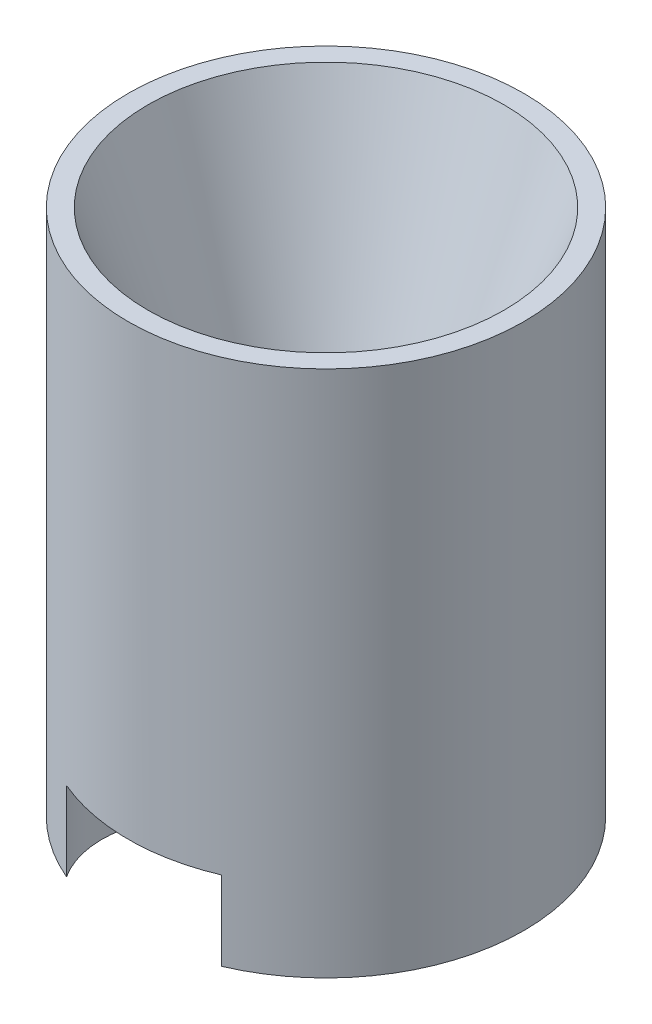
ISO-10303-21;
HEADER;
FILE_DESCRIPTION(('STEP AP214'),'2;1');
FILE_NAME('part.step','',(''),(''),'','','');
FILE_SCHEMA(('AUTOMOTIVE_DESIGN { 1 0 10303 214 1 1 1 1 }'));
ENDSEC;
DATA;
#1=APPLICATION_CONTEXT('core data for automotive mechanical design processes');
#2=APPLICATION_PROTOCOL_DEFINITION('international standard','automotive_design',2000,#1);
#3=PRODUCT_CONTEXT('',#1,'mechanical');
#4=PRODUCT('Part','Part','',(#3));
#5=PRODUCT_RELATED_PRODUCT_CATEGORY('part','',(#4));
#6=PRODUCT_DEFINITION_FORMATION('','',#4);
#7=PRODUCT_DEFINITION_CONTEXT('part definition',#1,'design');
#8=PRODUCT_DEFINITION('design','',#6,#7);
#9=PRODUCT_DEFINITION_SHAPE('','',#8);
#10=(LENGTH_UNIT() NAMED_UNIT(*) SI_UNIT(.MILLI.,.METRE.));
#11=(NAMED_UNIT(*) PLANE_ANGLE_UNIT() SI_UNIT($,.RADIAN.));
#12=(NAMED_UNIT(*) SI_UNIT($,.STERADIAN.) SOLID_ANGLE_UNIT());
#13=UNCERTAINTY_MEASURE_WITH_UNIT(LENGTH_MEASURE(1.E-05),#10,'distance_accuracy_value','');
#14=(GEOMETRIC_REPRESENTATION_CONTEXT(3) GLOBAL_UNCERTAINTY_ASSIGNED_CONTEXT((#13)) GLOBAL_UNIT_ASSIGNED_CONTEXT((#10,
#11,#12)) REPRESENTATION_CONTEXT('',''));
#15=CARTESIAN_POINT('',(0.,0.,0.));
#16=DIRECTION('',(0.,0.,1.));
#17=DIRECTION('',(1.,0.,0.));
#18=AXIS2_PLACEMENT_3D('',#15,#16,#17);
#19=CARTESIAN_POINT('',(0.,20.,0.));
#20=DIRECTION('',(0.,1.,0.));
#21=DIRECTION('',(0.,0.,1.));
#22=AXIS2_PLACEMENT_3D('',#19,#20,#21);
#23=PLANE('',#22);
#24=CARTESIAN_POINT('',(0.,20.,0.));
#25=DIRECTION('',(0.,1.,0.));
#26=DIRECTION('',(0.,0.,1.));
#27=AXIS2_PLACEMENT_3D('',#24,#25,#26);
#28=CIRCLE('',#27,6.75);
#29=CARTESIAN_POINT('',(0.,20.,6.75));
#30=VERTEX_POINT('',#29);
#31=EDGE_CURVE('E105',#30,#30,#28,.F.);
#32=ORIENTED_EDGE('',*,*,#31,.T.);
#33=EDGE_LOOP('',(#32));
#34=FACE_BOUND('',#33,.T.);
#35=CARTESIAN_POINT('',(0.,20.,0.));
#36=DIRECTION('',(0.,1.,0.));
#37=DIRECTION('',(0.,0.,1.));
#38=AXIS2_PLACEMENT_3D('',#35,#36,#37);
#39=CIRCLE('',#38,7.5);
#40=CARTESIAN_POINT('',(0.,20.,7.5));
#41=VERTEX_POINT('',#40);
#42=EDGE_CURVE('E91',#41,#41,#39,.T.);
#43=ORIENTED_EDGE('',*,*,#42,.T.);
#44=EDGE_LOOP('',(#43));
#45=FACE_BOUND('',#44,.T.);
#46=ADVANCED_FACE('F47',(#34,#45),#23,.T.);
#47=CARTESIAN_POINT('',(0.,0.,0.));
#48=DIRECTION('',(0.,1.,0.));
#49=DIRECTION('',(0.,0.,1.));
#50=AXIS2_PLACEMENT_3D('',#47,#48,#49);
#51=PLANE('',#50);
#52=CARTESIAN_POINT('',(0.,0.,0.));
#53=DIRECTION('',(0.,1.,0.));
#54=DIRECTION('',(0.,0.,1.));
#55=AXIS2_PLACEMENT_3D('',#52,#53,#54);
#56=CIRCLE('',#55,7.5);
#57=CARTESIAN_POINT('',(2.93938769133981,0.,6.9));
#58=VERTEX_POINT('',#57);
#59=CARTESIAN_POINT('',(-2.93938769133981,0.,6.9));
#60=VERTEX_POINT('',#59);
#61=EDGE_CURVE('E86',#58,#60,#56,.T.);
#62=ORIENTED_EDGE('',*,*,#61,.F.);
#63=CARTESIAN_POINT('',(0.,0.,5.));
#64=DIRECTION('',(0.,-1.,0.));
#65=DIRECTION('',(0.,0.,-1.));
#66=AXIS2_PLACEMENT_3D('',#63,#64,#65);
#67=CIRCLE('',#66,3.5);
#68=EDGE_CURVE('E75',#60,#58,#67,.T.);
#69=ORIENTED_EDGE('',*,*,#68,.F.);
#70=EDGE_LOOP('',(#62,#69));
#71=FACE_BOUND('',#70,.T.);
#72=CARTESIAN_POINT('',(0.,0.,0.));
#73=DIRECTION('',(0.,1.,0.));
#74=DIRECTION('',(0.,0.,1.));
#75=AXIS2_PLACEMENT_3D('',#72,#73,#74);
#76=CIRCLE('',#75,0.75);
#77=CARTESIAN_POINT('',(0.,0.,0.75));
#78=VERTEX_POINT('',#77);
#79=EDGE_CURVE('E92',#78,#78,#76,.T.);
#80=ORIENTED_EDGE('',*,*,#79,.T.);
#81=EDGE_LOOP('',(#80));
#82=FACE_BOUND('',#81,.T.);
#83=ADVANCED_FACE('F88',(#71,#82),#51,.F.);
#84=CARTESIAN_POINT('',(0.,20.,0.));
#85=DIRECTION('',(0.,-1.,0.));
#86=DIRECTION('',(0.,0.,-1.));
#87=AXIS2_PLACEMENT_3D('',#84,#85,#86);
#88=CYLINDRICAL_SURFACE('',#87,7.5);
#89=ORIENTED_EDGE('',*,*,#61,.T.);
#90=DIRECTION('',(0.,-1.,0.));
#91=VECTOR('',#90,1.);
#92=CARTESIAN_POINT('',(-2.93938769133981,1.5,6.9));
#93=LINE('',#92,#91);
#94=CARTESIAN_POINT('',(-2.93938769133981,3.,6.9));
#95=VERTEX_POINT('',#94);
#96=EDGE_CURVE('E11',#60,#95,#93,.F.);
#97=ORIENTED_EDGE('',*,*,#96,.T.);
#98=CARTESIAN_POINT('',(0.,3.,0.));
#99=DIRECTION('',(0.,-1.,0.));
#100=DIRECTION('',(0.,0.,-1.));
#101=AXIS2_PLACEMENT_3D('',#98,#99,#100);
#102=CIRCLE('',#101,7.5);
#103=CARTESIAN_POINT('',(2.93938769133981,3.,6.9));
#104=VERTEX_POINT('',#103);
#105=EDGE_CURVE('E67',#104,#95,#102,.T.);
#106=ORIENTED_EDGE('',*,*,#105,.F.);
#107=DIRECTION('',(0.,-1.,0.));
#108=VECTOR('',#107,1.);
#109=CARTESIAN_POINT('',(2.93938769133981,1.5,6.9));
#110=LINE('',#109,#108);
#111=EDGE_CURVE('E57',#104,#58,#110,.T.);
#112=ORIENTED_EDGE('',*,*,#111,.T.);
#113=EDGE_LOOP('',(#89,#97,#106,#112));
#114=FACE_BOUND('',#113,.T.);
#115=ORIENTED_EDGE('',*,*,#42,.F.);
#116=EDGE_LOOP('',(#115));
#117=FACE_BOUND('',#116,.T.);
#118=ADVANCED_FACE('F84',(#114,#117),#88,.T.);
#119=CARTESIAN_POINT('',(0.,20.,0.));
#120=DIRECTION('',(0.,-1.,0.));
#121=DIRECTION('',(0.,0.,-1.));
#122=AXIS2_PLACEMENT_3D('',#119,#120,#121);
#123=CYLINDRICAL_SURFACE('',#122,0.75);
#124=CARTESIAN_POINT('',(0.,3.51513548327231,0.));
#125=DIRECTION('',(0.,1.,0.));
#126=DIRECTION('',(0.,0.,1.));
#127=AXIS2_PLACEMENT_3D('',#124,#125,#126);
#128=CIRCLE('',#127,0.75);
#129=CARTESIAN_POINT('',(0.,3.51513548327231,0.75));
#130=VERTEX_POINT('',#129);
#131=EDGE_CURVE('E97',#130,#130,#128,.T.);
#132=ORIENTED_EDGE('',*,*,#131,.T.);
#133=EDGE_LOOP('',(#132));
#134=FACE_BOUND('',#133,.T.);
#135=ORIENTED_EDGE('',*,*,#79,.F.);
#136=EDGE_LOOP('',(#135));
#137=FACE_BOUND('',#136,.T.);
#138=ADVANCED_FACE('F116',(#134,#137),#123,.F.);
#139=CARTESIAN_POINT('',(0.,3.51513548327231,0.));
#140=DIRECTION('',(0.,1.,0.));
#141=DIRECTION('',(0.,0.,1.));
#142=AXIS2_PLACEMENT_3D('',#139,#140,#141);
#143=CONICAL_SURFACE('',#142,0.75,0.349065850398867);
#144=CARTESIAN_POINT('',(0.,20.,6.75));
#145=CARTESIAN_POINT('',(0.,19.8282826612841,6.6875));
#146=CARTESIAN_POINT('',(0.,19.6565653225682,6.625));
#147=CARTESIAN_POINT('',(0.,19.3131306451363,6.5));
#148=CARTESIAN_POINT('',(0.,19.1414133064204,6.4375));
#149=CARTESIAN_POINT('',(0.,18.7979786289886,6.3125));
#150=CARTESIAN_POINT('',(0.,18.6262612902727,6.25));
#151=CARTESIAN_POINT('',(0.,18.2828266128409,6.125));
#152=CARTESIAN_POINT('',(0.,18.1111092741249,6.0625));
#153=CARTESIAN_POINT('',(0.,17.7676745966931,5.9375));
#154=CARTESIAN_POINT('',(0.,17.5959572579772,5.875));
#155=CARTESIAN_POINT('',(0.,17.2525225805454,5.75));
#156=CARTESIAN_POINT('',(0.,17.0808052418295,5.6875));
#157=CARTESIAN_POINT('',(0.,16.7373705643976,5.5625));
#158=CARTESIAN_POINT('',(0.,16.5656532256817,5.5));
#159=CARTESIAN_POINT('',(0.,16.2222185482499,5.375));
#160=CARTESIAN_POINT('',(0.,16.050501209534,5.3125));
#161=CARTESIAN_POINT('',(0.,15.7070665321022,5.1875));
#162=CARTESIAN_POINT('',(0.,15.5353491933862,5.125));
#163=CARTESIAN_POINT('',(0.,15.1919145159544,5.));
#164=CARTESIAN_POINT('',(0.,15.0201971772385,4.9375));
#165=CARTESIAN_POINT('',(0.,14.6767624998067,4.8125));
#166=CARTESIAN_POINT('',(0.,14.5050451610908,4.75));
#167=CARTESIAN_POINT('',(0.,14.1616104836589,4.625));
#168=CARTESIAN_POINT('',(0.,13.989893144943,4.5625));
#169=CARTESIAN_POINT('',(0.,13.6464584675112,4.4375));
#170=CARTESIAN_POINT('',(0.,13.4747411287953,4.375));
#171=CARTESIAN_POINT('',(0.,13.1313064513635,4.25));
#172=CARTESIAN_POINT('',(0.,12.9595891126475,4.1875));
#173=CARTESIAN_POINT('',(0.,12.6161544352157,4.0625));
#174=CARTESIAN_POINT('',(0.,12.4444370964998,4.));
#175=CARTESIAN_POINT('',(0.,12.101002419068,3.875));
#176=CARTESIAN_POINT('',(0.,11.9292850803521,3.8125));
#177=CARTESIAN_POINT('',(0.,11.5858504029202,3.6875));
#178=CARTESIAN_POINT('',(0.,11.4141330642043,3.625));
#179=CARTESIAN_POINT('',(0.,11.0706983867725,3.5));
#180=CARTESIAN_POINT('',(0.,10.8989810480566,3.4375));
#181=CARTESIAN_POINT('',(0.,10.5555463706248,3.3125));
#182=CARTESIAN_POINT('',(0.,10.3838290319088,3.25));
#183=CARTESIAN_POINT('',(0.,10.040394354477,3.125));
#184=CARTESIAN_POINT('',(0.,9.8686770157611,3.0625));
#185=CARTESIAN_POINT('',(0.,9.52524233832928,2.9375));
#186=CARTESIAN_POINT('',(0.,9.35352499961336,2.875));
#187=CARTESIAN_POINT('',(0.,9.01009032218154,2.75));
#188=CARTESIAN_POINT('',(0.,8.83837298346562,2.6875));
#189=CARTESIAN_POINT('',(0.,8.4949383060338,2.5625));
#190=CARTESIAN_POINT('',(0.,8.32322096731788,2.5));
#191=CARTESIAN_POINT('',(0.,7.97978628988606,2.375));
#192=CARTESIAN_POINT('',(0.,7.80806895117014,2.3125));
#193=CARTESIAN_POINT('',(0.,7.46463427373832,2.1875));
#194=CARTESIAN_POINT('',(0.,7.2929169350224,2.125));
#195=CARTESIAN_POINT('',(0.,6.94948225759057,2.));
#196=CARTESIAN_POINT('',(0.,6.77776491887466,1.9375));
#197=CARTESIAN_POINT('',(0.,6.43433024144283,1.8125));
#198=CARTESIAN_POINT('',(0.,6.26261290272692,1.75));
#199=CARTESIAN_POINT('',(0.,5.9191782252951,1.625));
#200=CARTESIAN_POINT('',(0.,5.74746088657918,1.5625));
#201=CARTESIAN_POINT('',(0.,5.40402620914735,1.4375));
#202=CARTESIAN_POINT('',(0.,5.23230887043144,1.375));
#203=CARTESIAN_POINT('',(0.,4.88887419299961,1.25));
#204=CARTESIAN_POINT('',(0.,4.7171568542837,1.1875));
#205=CARTESIAN_POINT('',(0.,4.37372217685187,1.0625));
#206=CARTESIAN_POINT('',(0.,4.20200483813596,1.));
#207=CARTESIAN_POINT('',(0.,3.85857016070413,0.875));
#208=CARTESIAN_POINT('',(0.,3.68685282198822,0.8125));
#209=CARTESIAN_POINT('',(0.,3.51513548327231,0.75));
#210=B_SPLINE_CURVE_WITH_KNOTS('',3,(#144,#145,#146,#147,#148,#149,#150,#151,#152,#153,#154,
#155,#156,#157,#158,#159,#160,#161,#162,#163,#164,#165,#166,#167,#168,#169,#170,#171,#172,#173,
#174,#175,#176,#177,#178,#179,#180,#181,#182,#183,#184,#185,#186,#187,#188,#189,#190,#191,#192,
#193,#194,#195,#196,#197,#198,#199,#200,#201,#202,#203,#204,#205,#206,#207,#208,#209),
.UNSPECIFIED.,.F.,.F.,(4,2,2,2,2,2,2,2,2,2,2,2,2,2,2,2,2,2,2,2,2,2,2,2,2,2,2,2,2,2,2,2,4),(0.,
0.548213325030578,1.09642665006116,1.64463997509173,2.19285330012231,2.74106662515289,
3.28927995018346,3.83749327521404,4.38570660024462,4.9339199252752,5.48213325030578,
6.03034657533635,6.57855990036693,7.12677322539751,7.67498655042809,8.22319987545866,
8.77141320048924,9.31962652551982,9.8678398505504,10.416053175581,10.9642665006116,
11.5124798256421,12.0606931506727,12.6089064757033,13.1571198007339,13.7053331257644,
14.253546450795,14.8017597758256,15.3499731008562,15.8981864258867,16.4463997509173,
16.9946130759479,17.5428264009785),.UNSPECIFIED.);
#211=EDGE_CURVE('BSEAM50',#30,#130,#210,.T.);
#212=ORIENTED_EDGE('',*,*,#31,.F.);
#213=ORIENTED_EDGE('',*,*,#131,.F.);
#214=ORIENTED_EDGE('',*,*,#211,.T.);
#215=ORIENTED_EDGE('',*,*,#211,.F.);
#216=EDGE_LOOP('',(#212,#214,#213,#215));
#217=FACE_BOUND('',#216,.T.);
#218=ADVANCED_FACE('F50',(#217),#143,.F.);
#219=CARTESIAN_POINT('',(0.,3.,5.));
#220=DIRECTION('',(0.,-1.,0.));
#221=DIRECTION('',(0.,0.,-1.));
#222=AXIS2_PLACEMENT_3D('',#219,#220,#221);
#223=CYLINDRICAL_SURFACE('',#222,3.5);
#224=ORIENTED_EDGE('',*,*,#68,.T.);
#225=ORIENTED_EDGE('',*,*,#111,.F.);
#226=CARTESIAN_POINT('',(0.,3.,5.));
#227=DIRECTION('',(0.,-1.,0.));
#228=DIRECTION('',(0.,0.,-1.));
#229=AXIS2_PLACEMENT_3D('',#226,#227,#228);
#230=CIRCLE('',#229,3.5);
#231=EDGE_CURVE('E63',#95,#104,#230,.T.);
#232=ORIENTED_EDGE('',*,*,#231,.F.);
#233=ORIENTED_EDGE('',*,*,#96,.F.);
#234=EDGE_LOOP('',(#224,#225,#232,#233));
#235=FACE_BOUND('',#234,.T.);
#236=ADVANCED_FACE('F77',(#235),#223,.F.);
#237=CARTESIAN_POINT('',(0.,3.,5.));
#238=DIRECTION('',(0.,-1.,0.));
#239=DIRECTION('',(0.,0.,-1.));
#240=AXIS2_PLACEMENT_3D('',#237,#238,#239);
#241=PLANE('',#240);
#242=ORIENTED_EDGE('',*,*,#105,.T.);
#243=ORIENTED_EDGE('',*,*,#231,.T.);
#244=EDGE_LOOP('',(#242,#243));
#245=FACE_BOUND('',#244,.T.);
#246=ADVANCED_FACE('F133',(#245),#241,.T.);
#247=CLOSED_SHELL('',(#46,#83,#118,#138,#218,#236,#246));
#248=MANIFOLD_SOLID_BREP('B2',#247);
#249=ADVANCED_BREP_SHAPE_REPRESENTATION('',(#18,#248),#14);
#250=SHAPE_DEFINITION_REPRESENTATION(#9,#249);
ENDSEC;
END-ISO-10303-21;
